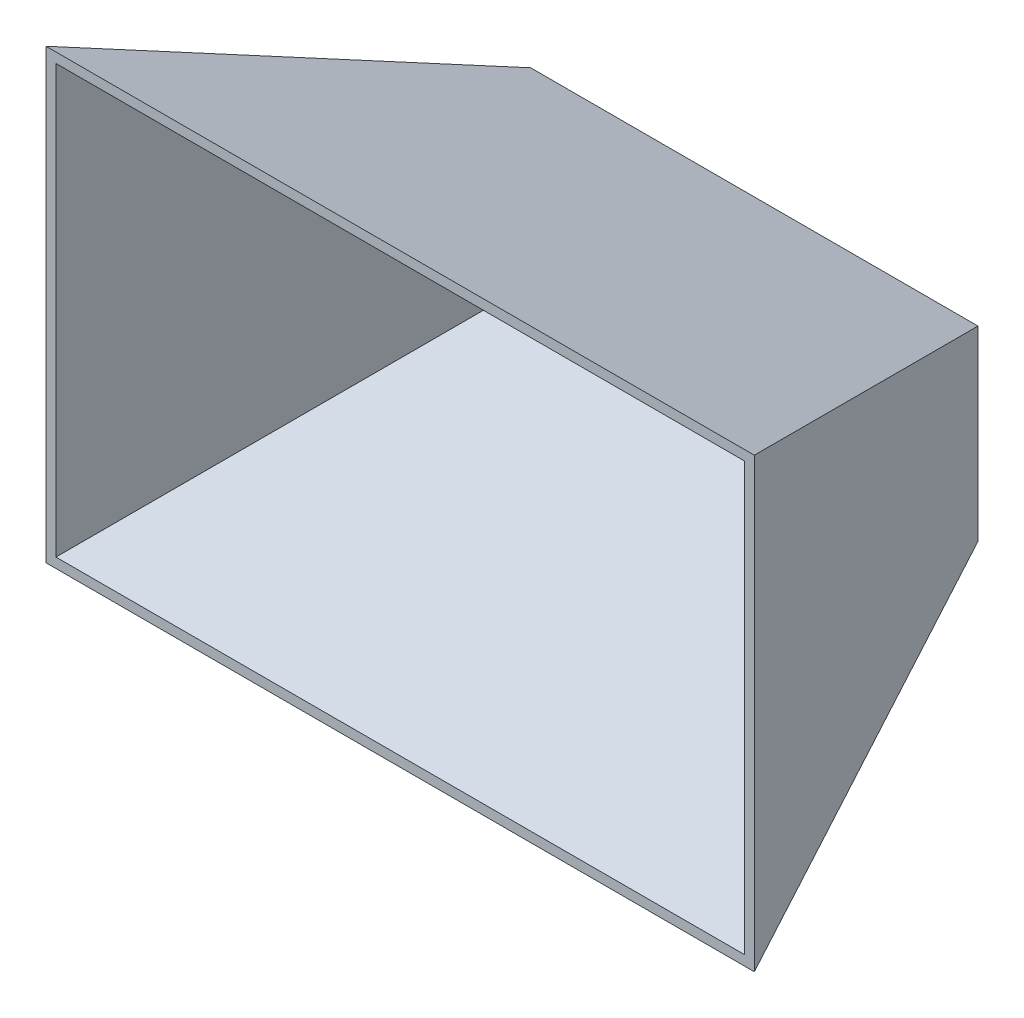
ISO-10303-21;
HEADER;
FILE_DESCRIPTION(('STEP AP214'),'2;1');
FILE_NAME('part.step','',(''),(''),'','','');
FILE_SCHEMA(('AUTOMOTIVE_DESIGN { 1 0 10303 214 1 1 1 1 }'));
ENDSEC;
DATA;
#1=APPLICATION_CONTEXT('core data for automotive mechanical design processes');
#2=APPLICATION_PROTOCOL_DEFINITION('international standard','automotive_design',2000,#1);
#3=PRODUCT_CONTEXT('',#1,'mechanical');
#4=PRODUCT('Part','Part','',(#3));
#5=PRODUCT_RELATED_PRODUCT_CATEGORY('part','',(#4));
#6=PRODUCT_DEFINITION_FORMATION('','',#4);
#7=PRODUCT_DEFINITION_CONTEXT('part definition',#1,'design');
#8=PRODUCT_DEFINITION('design','',#6,#7);
#9=PRODUCT_DEFINITION_SHAPE('','',#8);
#10=(LENGTH_UNIT() NAMED_UNIT(*) SI_UNIT(.MILLI.,.METRE.));
#11=(NAMED_UNIT(*) PLANE_ANGLE_UNIT() SI_UNIT($,.RADIAN.));
#12=(NAMED_UNIT(*) SI_UNIT($,.STERADIAN.) SOLID_ANGLE_UNIT());
#13=UNCERTAINTY_MEASURE_WITH_UNIT(LENGTH_MEASURE(1.E-05),#10,'distance_accuracy_value','');
#14=(GEOMETRIC_REPRESENTATION_CONTEXT(3) GLOBAL_UNCERTAINTY_ASSIGNED_CONTEXT((#13)) GLOBAL_UNIT_ASSIGNED_CONTEXT((#10,
#11,#12)) REPRESENTATION_CONTEXT('',''));
#15=CARTESIAN_POINT('',(0.,0.,0.));
#16=DIRECTION('',(0.,0.,1.));
#17=DIRECTION('',(1.,0.,0.));
#18=AXIS2_PLACEMENT_3D('',#15,#16,#17);
#19=CARTESIAN_POINT('',(0.,0.,380.));
#20=DIRECTION('',(0.,0.,1.));
#21=DIRECTION('',(1.,0.,0.));
#22=AXIS2_PLACEMENT_3D('',#19,#20,#21);
#23=PLANE('',#22);
#24=DIRECTION('',(0.,-1.,0.));
#25=VECTOR('',#24,1.);
#26=CARTESIAN_POINT('',(-216.662326046884,0.,380.));
#27=LINE('',#26,#25);
#28=CARTESIAN_POINT('',(-216.662326046884,-221.422170480322,380.));
#29=VERTEX_POINT('',#28);
#30=CARTESIAN_POINT('',(-216.662326046884,-680.108005499989,380.));
#31=VERTEX_POINT('',#30);
#32=EDGE_CURVE('E164',#29,#31,#27,.T.);
#33=ORIENTED_EDGE('',*,*,#32,.F.);
#34=DIRECTION('',(-1.,0.,0.));
#35=VECTOR('',#34,1.);
#36=CARTESIAN_POINT('',(0.,-221.422170480322,380.));
#37=LINE('',#36,#35);
#38=CARTESIAN_POINT('',(522.023508972782,-221.422170480322,380.));
#39=VERTEX_POINT('',#38);
#40=EDGE_CURVE('E143',#39,#29,#37,.T.);
#41=ORIENTED_EDGE('',*,*,#40,.F.);
#42=DIRECTION('',(0.,1.,0.));
#43=VECTOR('',#42,1.);
#44=CARTESIAN_POINT('',(522.023508972782,0.,380.));
#45=LINE('',#44,#43);
#46=CARTESIAN_POINT('',(522.023508972782,-680.108005499989,380.));
#47=VERTEX_POINT('',#46);
#48=EDGE_CURVE('E66',#47,#39,#45,.T.);
#49=ORIENTED_EDGE('',*,*,#48,.F.);
#50=DIRECTION('',(1.,0.,0.));
#51=VECTOR('',#50,1.);
#52=CARTESIAN_POINT('',(0.,-680.108005499989,380.));
#53=LINE('',#52,#51);
#54=EDGE_CURVE('E167',#31,#47,#53,.T.);
#55=ORIENTED_EDGE('',*,*,#54,.F.);
#56=EDGE_LOOP('',(#33,#41,#49,#55));
#57=FACE_BOUND('',#56,.T.);
#58=DIRECTION('',(0.,-1.,0.));
#59=VECTOR('',#58,1.);
#60=CARTESIAN_POINT('',(-227.319408537051,-210.765087990156,380.));
#61=LINE('',#60,#59);
#62=CARTESIAN_POINT('',(-227.319408537051,-210.765087990156,380.));
#63=VERTEX_POINT('',#62);
#64=CARTESIAN_POINT('',(-227.319408537051,-690.765087990156,380.));
#65=VERTEX_POINT('',#64);
#66=EDGE_CURVE('E313',#63,#65,#61,.T.);
#67=ORIENTED_EDGE('',*,*,#66,.T.);
#68=DIRECTION('',(1.,0.,0.));
#69=VECTOR('',#68,1.);
#70=CARTESIAN_POINT('',(-227.319408537051,-690.765087990156,380.));
#71=LINE('',#70,#69);
#72=CARTESIAN_POINT('',(532.680591462949,-690.765087990156,380.));
#73=VERTEX_POINT('',#72);
#74=EDGE_CURVE('E307',#65,#73,#71,.T.);
#75=ORIENTED_EDGE('',*,*,#74,.T.);
#76=DIRECTION('',(0.,1.,0.));
#77=VECTOR('',#76,1.);
#78=CARTESIAN_POINT('',(532.680591462949,-690.765087990156,380.));
#79=LINE('',#78,#77);
#80=CARTESIAN_POINT('',(532.680591462949,-210.765087990156,380.));
#81=VERTEX_POINT('',#80);
#82=EDGE_CURVE('E216',#73,#81,#79,.T.);
#83=ORIENTED_EDGE('',*,*,#82,.T.);
#84=DIRECTION('',(-1.,0.,0.));
#85=VECTOR('',#84,1.);
#86=CARTESIAN_POINT('',(532.680591462949,-210.765087990156,380.));
#87=LINE('',#86,#85);
#88=EDGE_CURVE('E289',#81,#63,#87,.T.);
#89=ORIENTED_EDGE('',*,*,#88,.T.);
#90=EDGE_LOOP('',(#67,#75,#83,#89));
#91=FACE_BOUND('',#90,.T.);
#92=ADVANCED_FACE('F43',(#57,#91),#23,.T.);
#93=CARTESIAN_POINT('',(0.,0.,0.));
#94=DIRECTION('',(0.,0.,-1.));
#95=DIRECTION('',(-1.,0.,0.));
#96=AXIS2_PLACEMENT_3D('',#93,#94,#95);
#97=PLANE('',#96);
#98=DIRECTION('',(0.,-1.,0.));
#99=VECTOR('',#98,1.);
#100=CARTESIAN_POINT('',(385.707719499098,0.,0.));
#101=LINE('',#100,#99);
#102=CARTESIAN_POINT('',(385.707719499098,-357.737959954006,0.));
#103=VERTEX_POINT('',#102);
#104=CARTESIAN_POINT('',(385.707719499098,-543.792216026305,0.));
#105=VERTEX_POINT('',#104);
#106=EDGE_CURVE('E12',#103,#105,#101,.T.);
#107=ORIENTED_EDGE('',*,*,#106,.F.);
#108=DIRECTION('',(-1.,0.,0.));
#109=VECTOR('',#108,1.);
#110=CARTESIAN_POINT('',(0.,-357.737959954006,0.));
#111=LINE('',#110,#109);
#112=CARTESIAN_POINT('',(-80.3465365732002,-357.737959954006,0.));
#113=VERTEX_POINT('',#112);
#114=EDGE_CURVE('E292',#103,#113,#111,.T.);
#115=ORIENTED_EDGE('',*,*,#114,.T.);
#116=DIRECTION('',(0.,1.,0.));
#117=VECTOR('',#116,1.);
#118=CARTESIAN_POINT('',(-80.3465365732003,0.,0.));
#119=LINE('',#118,#117);
#120=CARTESIAN_POINT('',(-80.3465365732001,-543.792216026305,0.));
#121=VERTEX_POINT('',#120);
#122=EDGE_CURVE('E125',#121,#113,#119,.T.);
#123=ORIENTED_EDGE('',*,*,#122,.F.);
#124=DIRECTION('',(-1.,0.,0.));
#125=VECTOR('',#124,1.);
#126=CARTESIAN_POINT('',(0.,-543.792216026305,0.));
#127=LINE('',#126,#125);
#128=EDGE_CURVE('E51',#105,#121,#127,.T.);
#129=ORIENTED_EDGE('',*,*,#128,.F.);
#130=EDGE_LOOP('',(#107,#115,#123,#129));
#131=FACE_BOUND('',#130,.T.);
#132=DIRECTION('',(0.,-1.,0.));
#133=VECTOR('',#132,1.);
#134=CARTESIAN_POINT('',(-87.319408537051,-550.765087990156,0.));
#135=LINE('',#134,#133);
#136=CARTESIAN_POINT('',(-87.319408537051,-350.765087990156,0.));
#137=VERTEX_POINT('',#136);
#138=CARTESIAN_POINT('',(-87.319408537051,-550.765087990156,0.));
#139=VERTEX_POINT('',#138);
#140=EDGE_CURVE('E169',#137,#139,#135,.T.);
#141=ORIENTED_EDGE('',*,*,#140,.F.);
#142=DIRECTION('',(-1.,0.,0.));
#143=VECTOR('',#142,1.);
#144=CARTESIAN_POINT('',(-87.319408537051,-350.765087990156,0.));
#145=LINE('',#144,#143);
#146=CARTESIAN_POINT('',(392.680591462949,-350.765087990156,0.));
#147=VERTEX_POINT('',#146);
#148=EDGE_CURVE('E266',#147,#137,#145,.T.);
#149=ORIENTED_EDGE('',*,*,#148,.F.);
#150=DIRECTION('',(0.,1.,0.));
#151=VECTOR('',#150,1.);
#152=CARTESIAN_POINT('',(392.680591462949,-550.765087990156,0.));
#153=LINE('',#152,#151);
#154=CARTESIAN_POINT('',(392.680591462949,-550.765087990156,0.));
#155=VERTEX_POINT('',#154);
#156=EDGE_CURVE('E233',#155,#147,#153,.T.);
#157=ORIENTED_EDGE('',*,*,#156,.F.);
#158=DIRECTION('',(1.,0.,0.));
#159=VECTOR('',#158,1.);
#160=CARTESIAN_POINT('',(-87.319408537051,-550.765087990156,0.));
#161=LINE('',#160,#159);
#162=EDGE_CURVE('E178',#139,#155,#161,.T.);
#163=ORIENTED_EDGE('',*,*,#162,.F.);
#164=EDGE_LOOP('',(#141,#149,#157,#163));
#165=FACE_BOUND('',#164,.T.);
#166=ADVANCED_FACE('F243',(#131,#165),#97,.T.);
#167=CARTESIAN_POINT('',(345.750471995426,0.,-127.38175284042));
#168=DIRECTION('',(-0.93834311681711,0.,0.345705358827356));
#169=DIRECTION('',(0.345705358827356,0.,0.93834311681711));
#170=AXIS2_PLACEMENT_3D('',#167,#168,#169);
#171=PLANE('',#170);
#172=DIRECTION('',(0.326732019606536,0.326732019606536,0.88684405321774));
#173=VECTOR('',#172,1.);
#174=CARTESIAN_POINT('',(392.680591462949,-350.765087990156,0.));
#175=LINE('',#174,#173);
#176=EDGE_CURVE('E232',#147,#81,#175,.T.);
#177=ORIENTED_EDGE('',*,*,#176,.T.);
#178=ORIENTED_EDGE('',*,*,#82,.F.);
#179=DIRECTION('',(0.326732019606536,-0.326732019606536,0.88684405321774));
#180=VECTOR('',#179,1.);
#181=CARTESIAN_POINT('',(392.680591462949,-550.765087990156,0.));
#182=LINE('',#181,#180);
#183=EDGE_CURVE('E488',#155,#73,#182,.T.);
#184=ORIENTED_EDGE('',*,*,#183,.F.);
#185=ORIENTED_EDGE('',*,*,#156,.T.);
#186=EDGE_LOOP('',(#177,#178,#184,#185));
#187=FACE_BOUND('',#186,.T.);
#188=ADVANCED_FACE('F197',(#187),#171,.F.);
#189=CARTESIAN_POINT('',(0.,-484.941943327917,-178.662821226075));
#190=DIRECTION('',(0.,0.93834311681711,0.345705358827356));
#191=DIRECTION('',(0.,-0.345705358827356,0.93834311681711));
#192=AXIS2_PLACEMENT_3D('',#189,#190,#191);
#193=PLANE('',#192);
#194=ORIENTED_EDGE('',*,*,#183,.T.);
#195=ORIENTED_EDGE('',*,*,#74,.F.);
#196=DIRECTION('',(-0.326732019606536,-0.326732019606536,0.88684405321774));
#197=VECTOR('',#196,1.);
#198=CARTESIAN_POINT('',(-87.319408537051,-550.765087990156,0.));
#199=LINE('',#198,#197);
#200=EDGE_CURVE('E184',#139,#65,#199,.T.);
#201=ORIENTED_EDGE('',*,*,#200,.F.);
#202=ORIENTED_EDGE('',*,*,#162,.T.);
#203=EDGE_LOOP('',(#194,#195,#201,#202));
#204=FACE_BOUND('',#203,.T.);
#205=ADVANCED_FACE('F186',(#204),#193,.F.);
#206=CARTESIAN_POINT('',(0.,-308.844382352308,113.784772445587));
#207=DIRECTION('',(0.,-0.93834311681711,0.345705358827356));
#208=DIRECTION('',(0.,-0.345705358827356,-0.93834311681711));
#209=AXIS2_PLACEMENT_3D('',#206,#207,#208);
#210=PLANE('',#209);
#211=DIRECTION('',(-0.326732019606536,0.326732019606536,0.88684405321774));
#212=VECTOR('',#211,1.);
#213=CARTESIAN_POINT('',(-87.319408537051,-350.765087990156,0.));
#214=LINE('',#213,#212);
#215=EDGE_CURVE('E479',#137,#63,#214,.T.);
#216=ORIENTED_EDGE('',*,*,#215,.T.);
#217=ORIENTED_EDGE('',*,*,#88,.F.);
#218=ORIENTED_EDGE('',*,*,#176,.F.);
#219=ORIENTED_EDGE('',*,*,#148,.T.);
#220=EDGE_LOOP('',(#216,#217,#218,#219));
#221=FACE_BOUND('',#220,.T.);
#222=ADVANCED_FACE('F196',(#221),#210,.F.);
#223=CARTESIAN_POINT('',(-76.8836743460376,0.,-28.3255642327507));
#224=DIRECTION('',(0.93834311681711,0.,0.345705358827356));
#225=DIRECTION('',(0.345705358827356,0.,-0.93834311681711));
#226=AXIS2_PLACEMENT_3D('',#223,#224,#225);
#227=PLANE('',#226);
#228=ORIENTED_EDGE('',*,*,#200,.T.);
#229=ORIENTED_EDGE('',*,*,#66,.F.);
#230=ORIENTED_EDGE('',*,*,#215,.F.);
#231=ORIENTED_EDGE('',*,*,#140,.T.);
#232=EDGE_LOOP('',(#228,#229,#230,#231));
#233=FACE_BOUND('',#232,.T.);
#234=ADVANCED_FACE('F349',(#233),#227,.F.);
#235=CARTESIAN_POINT('',(336.367040827255,0.,-123.924699252146));
#236=DIRECTION('',(-0.93834311681711,0.,0.345705358827356));
#237=DIRECTION('',(0.345705358827356,0.,0.93834311681711));
#238=AXIS2_PLACEMENT_3D('',#235,#236,#237);
#239=PLANE('',#238);
#240=DIRECTION('',(0.326732019606536,0.326732019606536,0.88684405321774));
#241=VECTOR('',#240,1.);
#242=CARTESIAN_POINT('',(379.824237543304,-363.621441909801,-5.96945102286969));
#243=LINE('',#242,#241);
#244=CARTESIAN_POINT('',(385.707719499098,-357.737959954006,10.));
#245=VERTEX_POINT('',#244);
#246=EDGE_CURVE('E161',#245,#39,#243,.T.);
#247=ORIENTED_EDGE('',*,*,#246,.F.);
#248=DIRECTION('',(0.,1.,0.));
#249=VECTOR('',#248,1.);
#250=CARTESIAN_POINT('',(385.707719499098,0.,10.));
#251=LINE('',#250,#249);
#252=CARTESIAN_POINT('',(385.707719499098,-543.792216026305,10.));
#253=VERTEX_POINT('',#252);
#254=EDGE_CURVE('E137',#253,#245,#251,.T.);
#255=ORIENTED_EDGE('',*,*,#254,.F.);
#256=DIRECTION('',(0.326732019606536,-0.326732019606536,0.88684405321774));
#257=VECTOR('',#256,1.);
#258=CARTESIAN_POINT('',(283.582454050853,-441.666950578059,-267.19714907381));
#259=LINE('',#258,#257);
#260=EDGE_CURVE('E148',#253,#47,#259,.T.);
#261=ORIENTED_EDGE('',*,*,#260,.T.);
#262=ORIENTED_EDGE('',*,*,#48,.T.);
#263=EDGE_LOOP('',(#247,#255,#261,#262));
#264=FACE_BOUND('',#263,.T.);
#265=ADVANCED_FACE('F337',(#264),#239,.T.);
#266=CARTESIAN_POINT('',(0.,-475.558512159746,-175.205767637801));
#267=DIRECTION('',(0.,0.93834311681711,0.345705358827356));
#268=DIRECTION('',(0.,-0.345705358827356,0.93834311681711));
#269=AXIS2_PLACEMENT_3D('',#266,#267,#268);
#270=PLANE('',#269);
#271=ORIENTED_EDGE('',*,*,#260,.F.);
#272=DIRECTION('',(1.,0.,0.));
#273=VECTOR('',#272,1.);
#274=CARTESIAN_POINT('',(0.,-543.792216026305,10.));
#275=LINE('',#274,#273);
#276=CARTESIAN_POINT('',(-80.3465365732001,-543.792216026305,10.));
#277=VERTEX_POINT('',#276);
#278=EDGE_CURVE('E158',#277,#253,#275,.T.);
#279=ORIENTED_EDGE('',*,*,#278,.F.);
#280=DIRECTION('',(-0.326732019606536,-0.326732019606536,0.88684405321774));
#281=VECTOR('',#280,1.);
#282=CARTESIAN_POINT('',(-10.8197416333837,-474.265421086488,-178.715586265216));
#283=LINE('',#282,#281);
#284=EDGE_CURVE('E147',#277,#31,#283,.T.);
#285=ORIENTED_EDGE('',*,*,#284,.T.);
#286=ORIENTED_EDGE('',*,*,#54,.T.);
#287=EDGE_LOOP('',(#271,#279,#285,#286));
#288=FACE_BOUND('',#287,.T.);
#289=ADVANCED_FACE('F342',(#288),#270,.T.);
#290=CARTESIAN_POINT('',(0.,-318.227813520479,117.241826033861));
#291=DIRECTION('',(0.,-0.93834311681711,0.345705358827356));
#292=DIRECTION('',(0.,-0.345705358827356,-0.93834311681711));
#293=AXIS2_PLACEMENT_3D('',#290,#291,#292);
#294=PLANE('',#293);
#295=DIRECTION('',(-0.326732019606536,0.326732019606536,0.88684405321774));
#296=VECTOR('',#295,1.);
#297=CARTESIAN_POINT('',(-107.061525125835,-331.022971401371,82.5121117857238));
#298=LINE('',#297,#296);
#299=CARTESIAN_POINT('',(-80.3465365732002,-357.737959954006,10.));
#300=VERTEX_POINT('',#299);
#301=EDGE_CURVE('E140',#300,#29,#298,.T.);
#302=ORIENTED_EDGE('',*,*,#301,.F.);
#303=DIRECTION('',(-1.,0.,0.));
#304=VECTOR('',#303,1.);
#305=CARTESIAN_POINT('',(0.,-357.737959954006,10.));
#306=LINE('',#305,#304);
#307=EDGE_CURVE('E132',#245,#300,#306,.T.);
#308=ORIENTED_EDGE('',*,*,#307,.F.);
#309=ORIENTED_EDGE('',*,*,#246,.T.);
#310=ORIENTED_EDGE('',*,*,#40,.T.);
#311=EDGE_LOOP('',(#302,#308,#309,#310));
#312=FACE_BOUND('',#311,.T.);
#313=ADVANCED_FACE('F141',(#312),#294,.T.);
#314=CARTESIAN_POINT('',(-67.5002431778665,0.,-24.8685106444771));
#315=DIRECTION('',(0.93834311681711,0.,0.345705358827356));
#316=DIRECTION('',(0.345705358827356,0.,-0.93834311681711));
#317=AXIS2_PLACEMENT_3D('',#314,#315,#316);
#318=PLANE('',#317);
#319=ORIENTED_EDGE('',*,*,#284,.F.);
#320=DIRECTION('',(0.,-1.,0.));
#321=VECTOR('',#320,1.);
#322=CARTESIAN_POINT('',(-80.3465365732002,0.,10.));
#323=LINE('',#322,#321);
#324=EDGE_CURVE('E122',#300,#277,#323,.T.);
#325=ORIENTED_EDGE('',*,*,#324,.F.);
#326=ORIENTED_EDGE('',*,*,#301,.T.);
#327=ORIENTED_EDGE('',*,*,#32,.T.);
#328=EDGE_LOOP('',(#319,#325,#326,#327));
#329=FACE_BOUND('',#328,.T.);
#330=ADVANCED_FACE('F151',(#329),#318,.T.);
#331=CARTESIAN_POINT('',(385.707719499098,-543.792216026305,-0.000100000000027162));
#332=DIRECTION('',(1.,0.,0.));
#333=DIRECTION('',(0.,0.,-1.));
#334=AXIS2_PLACEMENT_3D('',#331,#332,#333);
#335=PLANE('',#334);
#336=ORIENTED_EDGE('',*,*,#106,.T.);
#337=DIRECTION('',(0.,0.,1.));
#338=VECTOR('',#337,1.);
#339=CARTESIAN_POINT('',(385.707719499098,-543.792216026305,-0.000100000000027162));
#340=LINE('',#339,#338);
#341=EDGE_CURVE('E152',#105,#253,#340,.T.);
#342=ORIENTED_EDGE('',*,*,#341,.T.);
#343=ORIENTED_EDGE('',*,*,#254,.T.);
#344=DIRECTION('',(0.,0.,1.));
#345=VECTOR('',#344,1.);
#346=CARTESIAN_POINT('',(385.707719499098,-357.737959954006,-0.000100000000027162));
#347=LINE('',#346,#345);
#348=EDGE_CURVE('E128',#103,#245,#347,.T.);
#349=ORIENTED_EDGE('',*,*,#348,.F.);
#350=EDGE_LOOP('',(#336,#342,#343,#349));
#351=FACE_BOUND('',#350,.T.);
#352=ADVANCED_FACE('F335',(#351),#335,.F.);
#353=CARTESIAN_POINT('',(-80.3465365732001,-543.792216026305,-0.000100000000027162));
#354=DIRECTION('',(0.,-1.,0.));
#355=DIRECTION('',(0.,0.,-1.));
#356=AXIS2_PLACEMENT_3D('',#353,#354,#355);
#357=PLANE('',#356);
#358=ORIENTED_EDGE('',*,*,#128,.T.);
#359=DIRECTION('',(0.,0.,1.));
#360=VECTOR('',#359,1.);
#361=CARTESIAN_POINT('',(-80.3465365732001,-543.792216026305,-0.000100000000027162));
#362=LINE('',#361,#360);
#363=EDGE_CURVE('E127',#121,#277,#362,.T.);
#364=ORIENTED_EDGE('',*,*,#363,.T.);
#365=ORIENTED_EDGE('',*,*,#278,.T.);
#366=ORIENTED_EDGE('',*,*,#341,.F.);
#367=EDGE_LOOP('',(#358,#364,#365,#366));
#368=FACE_BOUND('',#367,.T.);
#369=ADVANCED_FACE('F331',(#368),#357,.F.);
#370=CARTESIAN_POINT('',(-80.3465365732002,-357.737959954006,-0.000100000000027162));
#371=DIRECTION('',(-1.,0.,0.));
#372=DIRECTION('',(0.,-1.,0.));
#373=AXIS2_PLACEMENT_3D('',#370,#371,#372);
#374=PLANE('',#373);
#375=ORIENTED_EDGE('',*,*,#122,.T.);
#376=DIRECTION('',(0.,0.,1.));
#377=VECTOR('',#376,1.);
#378=CARTESIAN_POINT('',(-80.3465365732002,-357.737959954006,-0.000100000000027162));
#379=LINE('',#378,#377);
#380=EDGE_CURVE('E58',#113,#300,#379,.T.);
#381=ORIENTED_EDGE('',*,*,#380,.T.);
#382=ORIENTED_EDGE('',*,*,#324,.T.);
#383=ORIENTED_EDGE('',*,*,#363,.F.);
#384=EDGE_LOOP('',(#375,#381,#382,#383));
#385=FACE_BOUND('',#384,.T.);
#386=ADVANCED_FACE('F119',(#385),#374,.F.);
#387=CARTESIAN_POINT('',(-80.3465365732002,-357.737959954006,-0.000100000000027162));
#388=DIRECTION('',(0.,-1.,0.));
#389=DIRECTION('',(0.,0.,-1.));
#390=AXIS2_PLACEMENT_3D('',#387,#388,#389);
#391=PLANE('',#390);
#392=ORIENTED_EDGE('',*,*,#348,.T.);
#393=ORIENTED_EDGE('',*,*,#307,.T.);
#394=ORIENTED_EDGE('',*,*,#380,.F.);
#395=ORIENTED_EDGE('',*,*,#114,.F.);
#396=EDGE_LOOP('',(#392,#393,#394,#395));
#397=FACE_BOUND('',#396,.T.);
#398=ADVANCED_FACE('F134',(#397),#391,.T.);
#399=CLOSED_SHELL('',(#92,#166,#188,#205,#222,#234,#265,#289,#313,#330,#352,#369,#386,#398));
#400=MANIFOLD_SOLID_BREP('B2',#399);
#401=ADVANCED_BREP_SHAPE_REPRESENTATION('',(#18,#400),#14);
#402=SHAPE_DEFINITION_REPRESENTATION(#9,#401);
ENDSEC;
END-ISO-10303-21;
